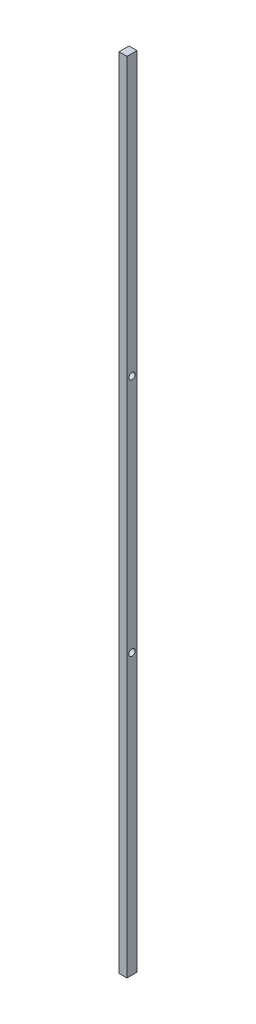
ISO-10303-21;
HEADER;
FILE_DESCRIPTION(('STEP AP214'),'2;1');
FILE_NAME('part.step','',(''),(''),'','','');
FILE_SCHEMA(('AUTOMOTIVE_DESIGN { 1 0 10303 214 1 1 1 1 }'));
ENDSEC;
DATA;
#1=APPLICATION_CONTEXT('core data for automotive mechanical design processes');
#2=APPLICATION_PROTOCOL_DEFINITION('international standard','automotive_design',2000,#1);
#3=PRODUCT_CONTEXT('',#1,'mechanical');
#4=PRODUCT('Part','Part','',(#3));
#5=PRODUCT_RELATED_PRODUCT_CATEGORY('part','',(#4));
#6=PRODUCT_DEFINITION_FORMATION('','',#4);
#7=PRODUCT_DEFINITION_CONTEXT('part definition',#1,'design');
#8=PRODUCT_DEFINITION('design','',#6,#7);
#9=PRODUCT_DEFINITION_SHAPE('','',#8);
#10=(LENGTH_UNIT() NAMED_UNIT(*) SI_UNIT(.MILLI.,.METRE.));
#11=(NAMED_UNIT(*) PLANE_ANGLE_UNIT() SI_UNIT($,.RADIAN.));
#12=(NAMED_UNIT(*) SI_UNIT($,.STERADIAN.) SOLID_ANGLE_UNIT());
#13=UNCERTAINTY_MEASURE_WITH_UNIT(LENGTH_MEASURE(1.E-05),#10,'distance_accuracy_value','');
#14=(GEOMETRIC_REPRESENTATION_CONTEXT(3) GLOBAL_UNCERTAINTY_ASSIGNED_CONTEXT((#13)) GLOBAL_UNIT_ASSIGNED_CONTEXT((#10,
#11,#12)) REPRESENTATION_CONTEXT('',''));
#15=CARTESIAN_POINT('',(0.,0.,0.));
#16=DIRECTION('',(0.,0.,1.));
#17=DIRECTION('',(1.,0.,0.));
#18=AXIS2_PLACEMENT_3D('',#15,#16,#17);
#19=CARTESIAN_POINT('',(0.,400.,0.));
#20=DIRECTION('',(1.,0.,0.));
#21=DIRECTION('',(0.,0.,-1.));
#22=AXIS2_PLACEMENT_3D('',#19,#20,#21);
#23=PLANE('',#22);
#24=CARTESIAN_POINT('',(0.,140.,-2.5));
#25=DIRECTION('',(1.,0.,0.));
#26=DIRECTION('',(0.,0.,-1.));
#27=AXIS2_PLACEMENT_3D('',#24,#25,#26);
#28=CIRCLE('',#27,1.6);
#29=CARTESIAN_POINT('',(0.,140.,-4.1));
#30=VERTEX_POINT('',#29);
#31=EDGE_CURVE('E105',#30,#30,#28,.T.);
#32=ORIENTED_EDGE('',*,*,#31,.T.);
#33=EDGE_LOOP('',(#32));
#34=FACE_BOUND('',#33,.T.);
#35=CARTESIAN_POINT('',(0.,260.,-2.5));
#36=DIRECTION('',(1.,0.,0.));
#37=DIRECTION('',(0.,0.,-1.));
#38=AXIS2_PLACEMENT_3D('',#35,#36,#37);
#39=CIRCLE('',#38,1.6);
#40=CARTESIAN_POINT('',(0.,260.,-4.1));
#41=VERTEX_POINT('',#40);
#42=EDGE_CURVE('E118',#41,#41,#39,.T.);
#43=ORIENTED_EDGE('',*,*,#42,.T.);
#44=EDGE_LOOP('',(#43));
#45=FACE_BOUND('',#44,.T.);
#46=DIRECTION('',(0.,0.,1.));
#47=VECTOR('',#46,1.);
#48=CARTESIAN_POINT('',(0.,0.,0.));
#49=LINE('',#48,#47);
#50=CARTESIAN_POINT('',(0.,0.,-5.));
#51=VERTEX_POINT('',#50);
#52=CARTESIAN_POINT('',(0.,0.,0.));
#53=VERTEX_POINT('',#52);
#54=EDGE_CURVE('E102',#51,#53,#49,.T.);
#55=ORIENTED_EDGE('',*,*,#54,.T.);
#56=DIRECTION('',(0.,-1.,0.));
#57=VECTOR('',#56,1.);
#58=CARTESIAN_POINT('',(0.,400.,0.));
#59=LINE('',#58,#57);
#60=CARTESIAN_POINT('',(0.,400.,0.));
#61=VERTEX_POINT('',#60);
#62=EDGE_CURVE('E11',#61,#53,#59,.T.);
#63=ORIENTED_EDGE('',*,*,#62,.F.);
#64=DIRECTION('',(0.,0.,1.));
#65=VECTOR('',#64,1.);
#66=CARTESIAN_POINT('',(0.,400.,0.));
#67=LINE('',#66,#65);
#68=CARTESIAN_POINT('',(0.,400.,-5.));
#69=VERTEX_POINT('',#68);
#70=EDGE_CURVE('E90',#69,#61,#67,.T.);
#71=ORIENTED_EDGE('',*,*,#70,.F.);
#72=DIRECTION('',(0.,-1.,0.));
#73=VECTOR('',#72,1.);
#74=CARTESIAN_POINT('',(0.,400.,-5.));
#75=LINE('',#74,#73);
#76=EDGE_CURVE('E98',#69,#51,#75,.T.);
#77=ORIENTED_EDGE('',*,*,#76,.T.);
#78=EDGE_LOOP('',(#55,#63,#71,#77));
#79=FACE_BOUND('',#78,.T.);
#80=ADVANCED_FACE('F39',(#34,#45,#79),#23,.F.);
#81=CARTESIAN_POINT('',(0.,400.,0.));
#82=DIRECTION('',(0.,0.,-1.));
#83=DIRECTION('',(-1.,0.,0.));
#84=AXIS2_PLACEMENT_3D('',#81,#82,#83);
#85=PLANE('',#84);
#86=DIRECTION('',(1.,0.,0.));
#87=VECTOR('',#86,1.);
#88=CARTESIAN_POINT('',(0.,0.,0.));
#89=LINE('',#88,#87);
#90=CARTESIAN_POINT('',(4.,0.,0.));
#91=VERTEX_POINT('',#90);
#92=EDGE_CURVE('E94',#53,#91,#89,.T.);
#93=ORIENTED_EDGE('',*,*,#92,.T.);
#94=DIRECTION('',(0.,-1.,0.));
#95=VECTOR('',#94,1.);
#96=CARTESIAN_POINT('',(4.,400.,0.));
#97=LINE('',#96,#95);
#98=CARTESIAN_POINT('',(4.,400.,0.));
#99=VERTEX_POINT('',#98);
#100=EDGE_CURVE('E47',#99,#91,#97,.T.);
#101=ORIENTED_EDGE('',*,*,#100,.F.);
#102=DIRECTION('',(1.,0.,0.));
#103=VECTOR('',#102,1.);
#104=CARTESIAN_POINT('',(0.,400.,0.));
#105=LINE('',#104,#103);
#106=EDGE_CURVE('E85',#61,#99,#105,.T.);
#107=ORIENTED_EDGE('',*,*,#106,.F.);
#108=ORIENTED_EDGE('',*,*,#62,.T.);
#109=EDGE_LOOP('',(#93,#101,#107,#108));
#110=FACE_BOUND('',#109,.T.);
#111=ADVANCED_FACE('F93',(#110),#85,.F.);
#112=CARTESIAN_POINT('',(4.,400.,0.));
#113=DIRECTION('',(-1.,0.,0.));
#114=DIRECTION('',(0.,0.,1.));
#115=AXIS2_PLACEMENT_3D('',#112,#113,#114);
#116=PLANE('',#115);
#117=CARTESIAN_POINT('',(4.,140.,-2.5));
#118=DIRECTION('',(1.,0.,0.));
#119=DIRECTION('',(0.,0.,-1.));
#120=AXIS2_PLACEMENT_3D('',#117,#118,#119);
#121=CIRCLE('',#120,1.6);
#122=CARTESIAN_POINT('',(4.,140.,-4.1));
#123=VERTEX_POINT('',#122);
#124=EDGE_CURVE('E121',#123,#123,#121,.T.);
#125=ORIENTED_EDGE('',*,*,#124,.F.);
#126=EDGE_LOOP('',(#125));
#127=FACE_BOUND('',#126,.T.);
#128=CARTESIAN_POINT('',(4.,260.,-2.5));
#129=DIRECTION('',(1.,0.,0.));
#130=DIRECTION('',(0.,0.,-1.));
#131=AXIS2_PLACEMENT_3D('',#128,#129,#130);
#132=CIRCLE('',#131,1.6);
#133=CARTESIAN_POINT('',(4.,260.,-4.1));
#134=VERTEX_POINT('',#133);
#135=EDGE_CURVE('E122',#134,#134,#132,.T.);
#136=ORIENTED_EDGE('',*,*,#135,.F.);
#137=EDGE_LOOP('',(#136));
#138=FACE_BOUND('',#137,.T.);
#139=DIRECTION('',(0.,0.,-1.));
#140=VECTOR('',#139,1.);
#141=CARTESIAN_POINT('',(4.,0.,0.));
#142=LINE('',#141,#140);
#143=CARTESIAN_POINT('',(4.,0.,-5.));
#144=VERTEX_POINT('',#143);
#145=EDGE_CURVE('E72',#91,#144,#142,.T.);
#146=ORIENTED_EDGE('',*,*,#145,.T.);
#147=DIRECTION('',(0.,-1.,0.));
#148=VECTOR('',#147,1.);
#149=CARTESIAN_POINT('',(4.,400.,-5.));
#150=LINE('',#149,#148);
#151=CARTESIAN_POINT('',(4.,400.,-5.));
#152=VERTEX_POINT('',#151);
#153=EDGE_CURVE('E95',#152,#144,#150,.T.);
#154=ORIENTED_EDGE('',*,*,#153,.F.);
#155=DIRECTION('',(0.,0.,-1.));
#156=VECTOR('',#155,1.);
#157=CARTESIAN_POINT('',(4.,400.,0.));
#158=LINE('',#157,#156);
#159=EDGE_CURVE('E88',#99,#152,#158,.T.);
#160=ORIENTED_EDGE('',*,*,#159,.F.);
#161=ORIENTED_EDGE('',*,*,#100,.T.);
#162=EDGE_LOOP('',(#146,#154,#160,#161));
#163=FACE_BOUND('',#162,.T.);
#164=ADVANCED_FACE('F96',(#127,#138,#163),#116,.F.);
#165=CARTESIAN_POINT('',(0.,400.,-5.));
#166=DIRECTION('',(0.,0.,1.));
#167=DIRECTION('',(1.,0.,0.));
#168=AXIS2_PLACEMENT_3D('',#165,#166,#167);
#169=PLANE('',#168);
#170=DIRECTION('',(-1.,0.,0.));
#171=VECTOR('',#170,1.);
#172=CARTESIAN_POINT('',(0.,0.,-5.));
#173=LINE('',#172,#171);
#174=EDGE_CURVE('E78',#144,#51,#173,.T.);
#175=ORIENTED_EDGE('',*,*,#174,.T.);
#176=ORIENTED_EDGE('',*,*,#76,.F.);
#177=DIRECTION('',(-1.,0.,0.));
#178=VECTOR('',#177,1.);
#179=CARTESIAN_POINT('',(0.,400.,-5.));
#180=LINE('',#179,#178);
#181=EDGE_CURVE('E55',#152,#69,#180,.T.);
#182=ORIENTED_EDGE('',*,*,#181,.F.);
#183=ORIENTED_EDGE('',*,*,#153,.T.);
#184=EDGE_LOOP('',(#175,#176,#182,#183));
#185=FACE_BOUND('',#184,.T.);
#186=ADVANCED_FACE('F110',(#185),#169,.F.);
#187=CARTESIAN_POINT('',(0.,400.,0.));
#188=DIRECTION('',(0.,-1.,0.));
#189=DIRECTION('',(0.,0.,-1.));
#190=AXIS2_PLACEMENT_3D('',#187,#188,#189);
#191=PLANE('',#190);
#192=ORIENTED_EDGE('',*,*,#70,.T.);
#193=ORIENTED_EDGE('',*,*,#106,.T.);
#194=ORIENTED_EDGE('',*,*,#159,.T.);
#195=ORIENTED_EDGE('',*,*,#181,.T.);
#196=EDGE_LOOP('',(#192,#193,#194,#195));
#197=FACE_BOUND('',#196,.T.);
#198=ADVANCED_FACE('F86',(#197),#191,.F.);
#199=CARTESIAN_POINT('',(0.,0.,0.));
#200=DIRECTION('',(0.,-1.,0.));
#201=DIRECTION('',(0.,0.,-1.));
#202=AXIS2_PLACEMENT_3D('',#199,#200,#201);
#203=PLANE('',#202);
#204=ORIENTED_EDGE('',*,*,#54,.F.);
#205=ORIENTED_EDGE('',*,*,#174,.F.);
#206=ORIENTED_EDGE('',*,*,#145,.F.);
#207=ORIENTED_EDGE('',*,*,#92,.F.);
#208=EDGE_LOOP('',(#204,#205,#206,#207));
#209=FACE_BOUND('',#208,.T.);
#210=ADVANCED_FACE('F113',(#209),#203,.T.);
#211=CARTESIAN_POINT('',(-396.,260.,-2.5));
#212=DIRECTION('',(1.,0.,0.));
#213=DIRECTION('',(0.,0.,-1.));
#214=AXIS2_PLACEMENT_3D('',#211,#212,#213);
#215=CYLINDRICAL_SURFACE('',#214,1.6);
#216=ORIENTED_EDGE('',*,*,#135,.T.);
#217=EDGE_LOOP('',(#216));
#218=FACE_BOUND('',#217,.T.);
#219=ORIENTED_EDGE('',*,*,#42,.F.);
#220=EDGE_LOOP('',(#219));
#221=FACE_BOUND('',#220,.T.);
#222=ADVANCED_FACE('F136',(#218,#221),#215,.F.);
#223=CARTESIAN_POINT('',(-396.,140.,-2.5));
#224=DIRECTION('',(1.,0.,0.));
#225=DIRECTION('',(0.,0.,-1.));
#226=AXIS2_PLACEMENT_3D('',#223,#224,#225);
#227=CYLINDRICAL_SURFACE('',#226,1.6);
#228=ORIENTED_EDGE('',*,*,#124,.T.);
#229=EDGE_LOOP('',(#228));
#230=FACE_BOUND('',#229,.T.);
#231=ORIENTED_EDGE('',*,*,#31,.F.);
#232=EDGE_LOOP('',(#231));
#233=FACE_BOUND('',#232,.T.);
#234=ADVANCED_FACE('F128',(#230,#233),#227,.F.);
#235=CLOSED_SHELL('',(#80,#111,#164,#186,#198,#210,#222,#234));
#236=MANIFOLD_SOLID_BREP('B2',#235);
#237=ADVANCED_BREP_SHAPE_REPRESENTATION('',(#18,#236),#14);
#238=SHAPE_DEFINITION_REPRESENTATION(#9,#237);
ENDSEC;
END-ISO-10303-21;
